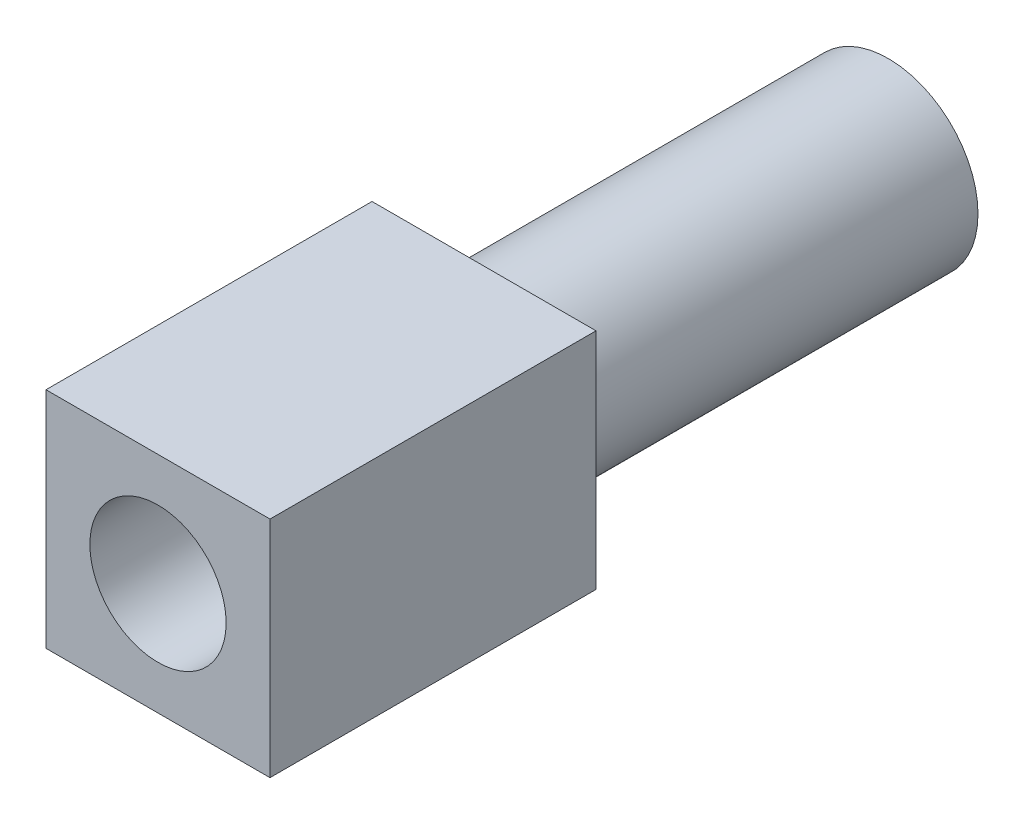
ISO-10303-21;
HEADER;
FILE_DESCRIPTION(('STEP AP214'),'2;1');
FILE_NAME('part.step','',(''),(''),'','','');
FILE_SCHEMA(('AUTOMOTIVE_DESIGN { 1 0 10303 214 1 1 1 1 }'));
ENDSEC;
DATA;
#1=APPLICATION_CONTEXT('core data for automotive mechanical design processes');
#2=APPLICATION_PROTOCOL_DEFINITION('international standard','automotive_design',2000,#1);
#3=PRODUCT_CONTEXT('',#1,'mechanical');
#4=PRODUCT('Part','Part','',(#3));
#5=PRODUCT_RELATED_PRODUCT_CATEGORY('part','',(#4));
#6=PRODUCT_DEFINITION_FORMATION('','',#4);
#7=PRODUCT_DEFINITION_CONTEXT('part definition',#1,'design');
#8=PRODUCT_DEFINITION('design','',#6,#7);
#9=PRODUCT_DEFINITION_SHAPE('','',#8);
#10=(LENGTH_UNIT() NAMED_UNIT(*) SI_UNIT(.MILLI.,.METRE.));
#11=(NAMED_UNIT(*) PLANE_ANGLE_UNIT() SI_UNIT($,.RADIAN.));
#12=(NAMED_UNIT(*) SI_UNIT($,.STERADIAN.) SOLID_ANGLE_UNIT());
#13=UNCERTAINTY_MEASURE_WITH_UNIT(LENGTH_MEASURE(1.E-05),#10,'distance_accuracy_value','');
#14=(GEOMETRIC_REPRESENTATION_CONTEXT(3) GLOBAL_UNCERTAINTY_ASSIGNED_CONTEXT((#13)) GLOBAL_UNIT_ASSIGNED_CONTEXT((#10,
#11,#12)) REPRESENTATION_CONTEXT('',''));
#15=CARTESIAN_POINT('',(0.,0.,0.));
#16=DIRECTION('',(0.,0.,1.));
#17=DIRECTION('',(1.,0.,0.));
#18=AXIS2_PLACEMENT_3D('',#15,#16,#17);
#19=CARTESIAN_POINT('',(0.,0.,0.));
#20=DIRECTION('',(0.,0.,1.));
#21=DIRECTION('',(1.,0.,0.));
#22=AXIS2_PLACEMENT_3D('',#19,#20,#21);
#23=PLANE('',#22);
#24=DIRECTION('',(0.,-1.,0.));
#25=VECTOR('',#24,1.);
#26=CARTESIAN_POINT('',(-37.0560711306256,15.4804,0.));
#27=LINE('',#26,#25);
#28=CARTESIAN_POINT('',(-37.0560711306256,15.4804,0.));
#29=VERTEX_POINT('',#28);
#30=CARTESIAN_POINT('',(-37.0560711306256,1.74039999999999,0.));
#31=VERTEX_POINT('',#30);
#32=EDGE_CURVE('E123',#29,#31,#27,.T.);
#33=ORIENTED_EDGE('',*,*,#32,.F.);
#34=DIRECTION('',(-1.,0.,0.));
#35=VECTOR('',#34,1.);
#36=CARTESIAN_POINT('',(-37.0560711306256,15.4804,0.));
#37=LINE('',#36,#35);
#38=CARTESIAN_POINT('',(-23.3160711306256,15.4804,0.));
#39=VERTEX_POINT('',#38);
#40=EDGE_CURVE('E78',#39,#29,#37,.T.);
#41=ORIENTED_EDGE('',*,*,#40,.F.);
#42=DIRECTION('',(0.,1.,0.));
#43=VECTOR('',#42,1.);
#44=CARTESIAN_POINT('',(-23.3160711306256,15.4804,0.));
#45=LINE('',#44,#43);
#46=CARTESIAN_POINT('',(-23.3160711306256,1.74039999999999,0.));
#47=VERTEX_POINT('',#46);
#48=EDGE_CURVE('E137',#47,#39,#45,.T.);
#49=ORIENTED_EDGE('',*,*,#48,.F.);
#50=DIRECTION('',(1.,0.,0.));
#51=VECTOR('',#50,1.);
#52=CARTESIAN_POINT('',(-37.0560711306256,1.74039999999999,0.));
#53=LINE('',#52,#51);
#54=EDGE_CURVE('E135',#31,#47,#53,.T.);
#55=ORIENTED_EDGE('',*,*,#54,.F.);
#56=EDGE_LOOP('',(#33,#41,#49,#55));
#57=FACE_BOUND('',#56,.T.);
#58=CARTESIAN_POINT('',(-30.1860711306256,8.61039999999999,0.));
#59=DIRECTION('',(0.,0.,1.));
#60=DIRECTION('',(1.,0.,0.));
#61=AXIS2_PLACEMENT_3D('',#58,#59,#60);
#62=CIRCLE('',#61,5.5);
#63=CARTESIAN_POINT('',(-24.6860711306256,8.61039999999999,0.));
#64=VERTEX_POINT('',#63);
#65=EDGE_CURVE('E11',#64,#64,#62,.F.);
#66=ORIENTED_EDGE('',*,*,#65,.F.);
#67=EDGE_LOOP('',(#66));
#68=FACE_BOUND('',#67,.T.);
#69=ADVANCED_FACE('F33',(#57,#68),#23,.F.);
#70=CARTESIAN_POINT('',(-37.0560711306256,15.4804,20.));
#71=DIRECTION('',(1.,0.,0.));
#72=DIRECTION('',(0.,0.,-1.));
#73=AXIS2_PLACEMENT_3D('',#70,#71,#72);
#74=PLANE('',#73);
#75=ORIENTED_EDGE('',*,*,#32,.T.);
#76=DIRECTION('',(0.,0.,-1.));
#77=VECTOR('',#76,1.);
#78=CARTESIAN_POINT('',(-37.0560711306256,1.74039999999999,20.));
#79=LINE('',#78,#77);
#80=CARTESIAN_POINT('',(-37.0560711306256,1.74039999999999,20.));
#81=VERTEX_POINT('',#80);
#82=EDGE_CURVE('E41',#81,#31,#79,.T.);
#83=ORIENTED_EDGE('',*,*,#82,.F.);
#84=DIRECTION('',(0.,-1.,0.));
#85=VECTOR('',#84,1.);
#86=CARTESIAN_POINT('',(-37.0560711306256,15.4804,20.));
#87=LINE('',#86,#85);
#88=CARTESIAN_POINT('',(-37.0560711306256,15.4804,20.));
#89=VERTEX_POINT('',#88);
#90=EDGE_CURVE('E126',#89,#81,#87,.T.);
#91=ORIENTED_EDGE('',*,*,#90,.F.);
#92=DIRECTION('',(0.,0.,-1.));
#93=VECTOR('',#92,1.);
#94=CARTESIAN_POINT('',(-37.0560711306256,15.4804,20.));
#95=LINE('',#94,#93);
#96=EDGE_CURVE('E132',#89,#29,#95,.T.);
#97=ORIENTED_EDGE('',*,*,#96,.T.);
#98=EDGE_LOOP('',(#75,#83,#91,#97));
#99=FACE_BOUND('',#98,.T.);
#100=ADVANCED_FACE('F35',(#99),#74,.F.);
#101=CARTESIAN_POINT('',(-37.0560711306256,1.74039999999999,20.));
#102=DIRECTION('',(0.,1.,0.));
#103=DIRECTION('',(0.,0.,1.));
#104=AXIS2_PLACEMENT_3D('',#101,#102,#103);
#105=PLANE('',#104);
#106=ORIENTED_EDGE('',*,*,#54,.T.);
#107=DIRECTION('',(0.,0.,-1.));
#108=VECTOR('',#107,1.);
#109=CARTESIAN_POINT('',(-23.3160711306256,1.74039999999999,20.));
#110=LINE('',#109,#108);
#111=CARTESIAN_POINT('',(-23.3160711306256,1.74039999999999,20.));
#112=VERTEX_POINT('',#111);
#113=EDGE_CURVE('E143',#112,#47,#110,.T.);
#114=ORIENTED_EDGE('',*,*,#113,.F.);
#115=DIRECTION('',(1.,0.,0.));
#116=VECTOR('',#115,1.);
#117=CARTESIAN_POINT('',(-37.0560711306256,1.74039999999999,20.));
#118=LINE('',#117,#116);
#119=EDGE_CURVE('E86',#81,#112,#118,.T.);
#120=ORIENTED_EDGE('',*,*,#119,.F.);
#121=ORIENTED_EDGE('',*,*,#82,.T.);
#122=EDGE_LOOP('',(#106,#114,#120,#121));
#123=FACE_BOUND('',#122,.T.);
#124=ADVANCED_FACE('F146',(#123),#105,.F.);
#125=CARTESIAN_POINT('',(-23.3160711306256,15.4804,20.));
#126=DIRECTION('',(-1.,0.,0.));
#127=DIRECTION('',(0.,-1.,0.));
#128=AXIS2_PLACEMENT_3D('',#125,#126,#127);
#129=PLANE('',#128);
#130=ORIENTED_EDGE('',*,*,#48,.T.);
#131=DIRECTION('',(0.,0.,-1.));
#132=VECTOR('',#131,1.);
#133=CARTESIAN_POINT('',(-23.3160711306256,15.4804,20.));
#134=LINE('',#133,#132);
#135=CARTESIAN_POINT('',(-23.3160711306256,15.4804,20.));
#136=VERTEX_POINT('',#135);
#137=EDGE_CURVE('E141',#136,#39,#134,.T.);
#138=ORIENTED_EDGE('',*,*,#137,.F.);
#139=DIRECTION('',(0.,1.,0.));
#140=VECTOR('',#139,1.);
#141=CARTESIAN_POINT('',(-23.3160711306256,15.4804,20.));
#142=LINE('',#141,#140);
#143=EDGE_CURVE('E129',#112,#136,#142,.T.);
#144=ORIENTED_EDGE('',*,*,#143,.F.);
#145=ORIENTED_EDGE('',*,*,#113,.T.);
#146=EDGE_LOOP('',(#130,#138,#144,#145));
#147=FACE_BOUND('',#146,.T.);
#148=ADVANCED_FACE('F155',(#147),#129,.F.);
#149=CARTESIAN_POINT('',(-37.0560711306256,15.4804,20.));
#150=DIRECTION('',(0.,-1.,0.));
#151=DIRECTION('',(0.,0.,-1.));
#152=AXIS2_PLACEMENT_3D('',#149,#150,#151);
#153=PLANE('',#152);
#154=ORIENTED_EDGE('',*,*,#40,.T.);
#155=ORIENTED_EDGE('',*,*,#96,.F.);
#156=DIRECTION('',(-1.,0.,0.));
#157=VECTOR('',#156,1.);
#158=CARTESIAN_POINT('',(-37.0560711306256,15.4804,20.));
#159=LINE('',#158,#157);
#160=EDGE_CURVE('E57',#136,#89,#159,.T.);
#161=ORIENTED_EDGE('',*,*,#160,.F.);
#162=ORIENTED_EDGE('',*,*,#137,.T.);
#163=EDGE_LOOP('',(#154,#155,#161,#162));
#164=FACE_BOUND('',#163,.T.);
#165=ADVANCED_FACE('F157',(#164),#153,.F.);
#166=CARTESIAN_POINT('',(0.,0.,20.));
#167=DIRECTION('',(0.,0.,1.));
#168=DIRECTION('',(1.,0.,0.));
#169=AXIS2_PLACEMENT_3D('',#166,#167,#168);
#170=PLANE('',#169);
#171=CARTESIAN_POINT('',(-30.1860711306256,8.61039999999999,20.));
#172=DIRECTION('',(0.,0.,1.));
#173=DIRECTION('',(1.,0.,0.));
#174=AXIS2_PLACEMENT_3D('',#171,#172,#173);
#175=CIRCLE('',#174,4.18);
#176=CARTESIAN_POINT('',(-26.0060711306256,8.61039999999999,20.));
#177=VERTEX_POINT('',#176);
#178=EDGE_CURVE('E118',#177,#177,#175,.T.);
#179=ORIENTED_EDGE('',*,*,#178,.F.);
#180=EDGE_LOOP('',(#179));
#181=FACE_BOUND('',#180,.T.);
#182=ORIENTED_EDGE('',*,*,#90,.T.);
#183=ORIENTED_EDGE('',*,*,#119,.T.);
#184=ORIENTED_EDGE('',*,*,#143,.T.);
#185=ORIENTED_EDGE('',*,*,#160,.T.);
#186=EDGE_LOOP('',(#182,#183,#184,#185));
#187=FACE_BOUND('',#186,.T.);
#188=ADVANCED_FACE('F158',(#181,#187),#170,.T.);
#189=CARTESIAN_POINT('',(-30.1860711306256,8.61039999999999,10.));
#190=DIRECTION('',(0.,0.,1.));
#191=DIRECTION('',(1.,0.,0.));
#192=AXIS2_PLACEMENT_3D('',#189,#190,#191);
#193=CYLINDRICAL_SURFACE('',#192,4.18);
#194=CARTESIAN_POINT('',(-30.1860711306256,8.61039999999999,10.));
#195=DIRECTION('',(0.,0.,1.));
#196=DIRECTION('',(1.,0.,0.));
#197=AXIS2_PLACEMENT_3D('',#194,#195,#196);
#198=CIRCLE('',#197,4.18);
#199=CARTESIAN_POINT('',(-26.0060711306256,8.61039999999999,10.));
#200=VERTEX_POINT('',#199);
#201=EDGE_CURVE('E120',#200,#200,#198,.T.);
#202=ORIENTED_EDGE('',*,*,#201,.F.);
#203=EDGE_LOOP('',(#202));
#204=FACE_BOUND('',#203,.T.);
#205=ORIENTED_EDGE('',*,*,#178,.T.);
#206=EDGE_LOOP('',(#205));
#207=FACE_BOUND('',#206,.T.);
#208=ADVANCED_FACE('F160',(#204,#207),#193,.F.);
#209=CARTESIAN_POINT('',(-30.1860711306256,8.61039999999999,10.));
#210=DIRECTION('',(0.,0.,1.));
#211=DIRECTION('',(1.,0.,0.));
#212=AXIS2_PLACEMENT_3D('',#209,#210,#211);
#213=PLANE('',#212);
#214=ORIENTED_EDGE('',*,*,#201,.T.);
#215=EDGE_LOOP('',(#214));
#216=FACE_BOUND('',#215,.T.);
#217=ADVANCED_FACE('F167',(#216),#213,.T.);
#218=CARTESIAN_POINT('',(-30.1860711306256,8.61039999999999,-24.8));
#219=DIRECTION('',(0.,0.,1.));
#220=DIRECTION('',(1.,0.,0.));
#221=AXIS2_PLACEMENT_3D('',#218,#219,#220);
#222=CYLINDRICAL_SURFACE('',#221,5.5);
#223=CARTESIAN_POINT('',(-30.1860711306256,8.61039999999999,-24.8));
#224=DIRECTION('',(0.,0.,-1.));
#225=DIRECTION('',(-1.,0.,0.));
#226=AXIS2_PLACEMENT_3D('',#223,#224,#225);
#227=CIRCLE('',#226,5.5);
#228=CARTESIAN_POINT('',(-24.6860711306256,8.61039999999999,-24.8));
#229=VERTEX_POINT('',#228);
#230=EDGE_CURVE('E110',#229,#229,#227,.T.);
#231=CARTESIAN_POINT('',(-24.6860711306256,8.61039999999999,-24.8));
#232=CARTESIAN_POINT('',(-24.6860711306256,8.61039999999999,-24.5416666666667));
#233=CARTESIAN_POINT('',(-24.6860711306256,8.61039999999999,-24.2833333333333));
#234=CARTESIAN_POINT('',(-24.6860711306256,8.61039999999999,-23.7666666666667));
#235=CARTESIAN_POINT('',(-24.6860711306256,8.61039999999999,-23.5083333333333));
#236=CARTESIAN_POINT('',(-24.6860711306256,8.61039999999999,-22.9916666666667));
#237=CARTESIAN_POINT('',(-24.6860711306256,8.61039999999999,-22.7333333333333));
#238=CARTESIAN_POINT('',(-24.6860711306256,8.61039999999999,-22.2166666666667));
#239=CARTESIAN_POINT('',(-24.6860711306256,8.61039999999999,-21.9583333333333));
#240=CARTESIAN_POINT('',(-24.6860711306256,8.61039999999999,-21.4416666666667));
#241=CARTESIAN_POINT('',(-24.6860711306256,8.61039999999999,-21.1833333333333));
#242=CARTESIAN_POINT('',(-24.6860711306256,8.61039999999999,-20.6666666666667));
#243=CARTESIAN_POINT('',(-24.6860711306256,8.61039999999999,-20.4083333333333));
#244=CARTESIAN_POINT('',(-24.6860711306256,8.61039999999999,-19.8916666666667));
#245=CARTESIAN_POINT('',(-24.6860711306256,8.61039999999999,-19.6333333333333));
#246=CARTESIAN_POINT('',(-24.6860711306256,8.61039999999999,-19.1166666666667));
#247=CARTESIAN_POINT('',(-24.6860711306256,8.61039999999999,-18.8583333333333));
#248=CARTESIAN_POINT('',(-24.6860711306256,8.61039999999999,-18.3416666666667));
#249=CARTESIAN_POINT('',(-24.6860711306256,8.61039999999999,-18.0833333333333));
#250=CARTESIAN_POINT('',(-24.6860711306256,8.61039999999999,-17.5666666666667));
#251=CARTESIAN_POINT('',(-24.6860711306256,8.61039999999999,-17.3083333333333));
#252=CARTESIAN_POINT('',(-24.6860711306256,8.61039999999999,-16.7916666666667));
#253=CARTESIAN_POINT('',(-24.6860711306256,8.61039999999999,-16.5333333333333));
#254=CARTESIAN_POINT('',(-24.6860711306256,8.61039999999999,-16.0166666666667));
#255=CARTESIAN_POINT('',(-24.6860711306256,8.61039999999999,-15.7583333333333));
#256=CARTESIAN_POINT('',(-24.6860711306256,8.61039999999999,-15.2416666666667));
#257=CARTESIAN_POINT('',(-24.6860711306256,8.61039999999999,-14.9833333333333));
#258=CARTESIAN_POINT('',(-24.6860711306256,8.61039999999999,-14.4666666666667));
#259=CARTESIAN_POINT('',(-24.6860711306256,8.61039999999999,-14.2083333333333));
#260=CARTESIAN_POINT('',(-24.6860711306256,8.61039999999999,-13.6916666666667));
#261=CARTESIAN_POINT('',(-24.6860711306256,8.61039999999999,-13.4333333333333));
#262=CARTESIAN_POINT('',(-24.6860711306256,8.61039999999999,-12.9166666666667));
#263=CARTESIAN_POINT('',(-24.6860711306256,8.61039999999999,-12.6583333333333));
#264=CARTESIAN_POINT('',(-24.6860711306256,8.61039999999999,-12.1416666666667));
#265=CARTESIAN_POINT('',(-24.6860711306256,8.61039999999999,-11.8833333333333));
#266=CARTESIAN_POINT('',(-24.6860711306256,8.61039999999999,-11.3666666666667));
#267=CARTESIAN_POINT('',(-24.6860711306256,8.61039999999999,-11.1083333333333));
#268=CARTESIAN_POINT('',(-24.6860711306256,8.61039999999999,-10.5916666666667));
#269=CARTESIAN_POINT('',(-24.6860711306256,8.61039999999999,-10.3333333333333));
#270=CARTESIAN_POINT('',(-24.6860711306256,8.61039999999999,-9.81666666666666));
#271=CARTESIAN_POINT('',(-24.6860711306256,8.61039999999999,-9.55833333333333));
#272=CARTESIAN_POINT('',(-24.6860711306256,8.61039999999999,-9.04166666666666));
#273=CARTESIAN_POINT('',(-24.6860711306256,8.61039999999999,-8.78333333333333));
#274=CARTESIAN_POINT('',(-24.6860711306256,8.61039999999999,-8.26666666666667));
#275=CARTESIAN_POINT('',(-24.6860711306256,8.61039999999999,-8.00833333333333));
#276=CARTESIAN_POINT('',(-24.6860711306256,8.61039999999999,-7.49166666666667));
#277=CARTESIAN_POINT('',(-24.6860711306256,8.61039999999999,-7.23333333333333));
#278=CARTESIAN_POINT('',(-24.6860711306256,8.61039999999999,-6.71666666666667));
#279=CARTESIAN_POINT('',(-24.6860711306256,8.61039999999999,-6.45833333333333));
#280=CARTESIAN_POINT('',(-24.6860711306256,8.61039999999999,-5.94166666666667));
#281=CARTESIAN_POINT('',(-24.6860711306256,8.61039999999999,-5.68333333333333));
#282=CARTESIAN_POINT('',(-24.6860711306256,8.61039999999999,-5.16666666666667));
#283=CARTESIAN_POINT('',(-24.6860711306256,8.61039999999999,-4.90833333333333));
#284=CARTESIAN_POINT('',(-24.6860711306256,8.61039999999999,-4.39166666666667));
#285=CARTESIAN_POINT('',(-24.6860711306256,8.61039999999999,-4.13333333333333));
#286=CARTESIAN_POINT('',(-24.6860711306256,8.61039999999999,-3.61666666666667));
#287=CARTESIAN_POINT('',(-24.6860711306256,8.61039999999999,-3.35833333333333));
#288=CARTESIAN_POINT('',(-24.6860711306256,8.61039999999999,-2.84166666666667));
#289=CARTESIAN_POINT('',(-24.6860711306256,8.61039999999999,-2.58333333333333));
#290=CARTESIAN_POINT('',(-24.6860711306256,8.61039999999999,-2.06666666666667));
#291=CARTESIAN_POINT('',(-24.6860711306256,8.61039999999999,-1.80833333333333));
#292=CARTESIAN_POINT('',(-24.6860711306256,8.61039999999999,-1.29166666666667));
#293=CARTESIAN_POINT('',(-24.6860711306256,8.61039999999999,-1.03333333333333));
#294=CARTESIAN_POINT('',(-24.6860711306256,8.61039999999999,-0.516666666666668));
#295=CARTESIAN_POINT('',(-24.6860711306256,8.61039999999999,-0.258333333333334));
#296=CARTESIAN_POINT('',(-24.6860711306256,8.61039999999999,0.));
#297=B_SPLINE_CURVE_WITH_KNOTS('',3,(#231,#232,#233,#234,#235,#236,#237,#238,#239,#240,#241,
#242,#243,#244,#245,#246,#247,#248,#249,#250,#251,#252,#253,#254,#255,#256,#257,#258,#259,#260,
#261,#262,#263,#264,#265,#266,#267,#268,#269,#270,#271,#272,#273,#274,#275,#276,#277,#278,#279,
#280,#281,#282,#283,#284,#285,#286,#287,#288,#289,#290,#291,#292,#293,#294,#295,#296),
.UNSPECIFIED.,.F.,.F.,(4,2,2,2,2,2,2,2,2,2,2,2,2,2,2,2,2,2,2,2,2,2,2,2,2,2,2,2,2,2,2,2,4),(0.,
0.775000000000001,1.55,2.325,3.1,3.875,4.65,5.425,6.2,6.975,7.75,8.525,9.3,10.075,10.85,11.625,
12.4,13.175,13.95,14.725,15.5,16.275,17.05,17.825,18.6,19.375,20.15,20.925,21.7,22.475,23.25,
24.025,24.8),.UNSPECIFIED.);
#298=EDGE_CURVE('BSEAM190',#229,#64,#297,.T.);
#299=ORIENTED_EDGE('',*,*,#230,.F.);
#300=ORIENTED_EDGE('',*,*,#65,.T.);
#301=ORIENTED_EDGE('',*,*,#298,.T.);
#302=ORIENTED_EDGE('',*,*,#298,.F.);
#303=EDGE_LOOP('',(#299,#301,#300,#302));
#304=FACE_BOUND('',#303,.T.);
#305=ADVANCED_FACE('F190',(#304),#222,.T.);
#306=CARTESIAN_POINT('',(-30.1860711306256,8.61039999999999,-24.8));
#307=DIRECTION('',(0.,0.,1.));
#308=DIRECTION('',(1.,0.,0.));
#309=AXIS2_PLACEMENT_3D('',#306,#307,#308);
#310=CYLINDRICAL_SURFACE('',#309,2.49);
#311=CARTESIAN_POINT('',(-30.1860711306256,8.61039999999999,0.));
#312=DIRECTION('',(0.,0.,-1.));
#313=DIRECTION('',(-1.,0.,0.));
#314=AXIS2_PLACEMENT_3D('',#311,#312,#313);
#315=CIRCLE('',#314,2.49);
#316=CARTESIAN_POINT('',(-27.6960711306256,8.61039999999999,0.));
#317=VERTEX_POINT('',#316);
#318=CARTESIAN_POINT('',(-29.6257900061276,11.0365461335895,0.));
#319=VERTEX_POINT('',#318);
#320=EDGE_CURVE('E97',#317,#319,#315,.T.);
#321=ORIENTED_EDGE('',*,*,#320,.F.);
#322=DIRECTION('',(0.,0.,-1.));
#323=VECTOR('',#322,1.);
#324=CARTESIAN_POINT('',(-27.6960711306256,8.61039999999999,0.));
#325=LINE('',#324,#323);
#326=CARTESIAN_POINT('',(-27.6960711306256,8.61039999999999,-24.8));
#327=VERTEX_POINT('',#326);
#328=EDGE_CURVE('E94',#317,#327,#325,.T.);
#329=ORIENTED_EDGE('',*,*,#328,.T.);
#330=CARTESIAN_POINT('',(-30.1860711306256,8.61039999999999,-24.8));
#331=DIRECTION('',(0.,0.,-1.));
#332=DIRECTION('',(-1.,0.,0.));
#333=AXIS2_PLACEMENT_3D('',#330,#331,#332);
#334=CIRCLE('',#333,2.49);
#335=CARTESIAN_POINT('',(-29.6257900061276,11.0365461335895,-24.8));
#336=VERTEX_POINT('',#335);
#337=EDGE_CURVE('E48',#327,#336,#334,.T.);
#338=ORIENTED_EDGE('',*,*,#337,.T.);
#339=DIRECTION('',(0.,0.,-1.));
#340=VECTOR('',#339,1.);
#341=CARTESIAN_POINT('',(-29.6257900061276,11.0365461335895,0.));
#342=LINE('',#341,#340);
#343=EDGE_CURVE('E102',#319,#336,#342,.T.);
#344=ORIENTED_EDGE('',*,*,#343,.F.);
#345=EDGE_LOOP('',(#321,#329,#338,#344));
#346=FACE_BOUND('',#345,.T.);
#347=ADVANCED_FACE('F95',(#346),#310,.F.);
#348=CARTESIAN_POINT('',(-12.7692197437434,-10.1564386513182,0.));
#349=DIRECTION('',(-0.78262778502887,-0.622489959839357,0.));
#350=DIRECTION('',(0.622489959839357,-0.78262778502887,0.));
#351=AXIS2_PLACEMENT_3D('',#348,#349,#350);
#352=PLANE('',#351);
#353=DIRECTION('',(-0.622489959839357,0.78262778502887,0.));
#354=VECTOR('',#353,1.);
#355=CARTESIAN_POINT('',(-12.7692197437434,-10.1564386513182,-24.8));
#356=LINE('',#355,#354);
#357=EDGE_CURVE('E109',#327,#336,#356,.T.);
#358=ORIENTED_EDGE('',*,*,#357,.F.);
#359=ORIENTED_EDGE('',*,*,#328,.F.);
#360=DIRECTION('',(-0.622489959839357,0.78262778502887,0.));
#361=VECTOR('',#360,1.);
#362=CARTESIAN_POINT('',(-12.7692197437434,-10.1564386513182,0.));
#363=LINE('',#362,#361);
#364=EDGE_CURVE('E103',#317,#319,#363,.T.);
#365=ORIENTED_EDGE('',*,*,#364,.T.);
#366=ORIENTED_EDGE('',*,*,#343,.T.);
#367=EDGE_LOOP('',(#358,#359,#365,#366));
#368=FACE_BOUND('',#367,.T.);
#369=ADVANCED_FACE('F112',(#368),#352,.T.);
#370=ORIENTED_EDGE('',*,*,#364,.F.);
#371=ORIENTED_EDGE('',*,*,#320,.T.);
#372=EDGE_LOOP('',(#370,#371));
#373=FACE_BOUND('',#372,.T.);
#374=ADVANCED_FACE('F174',(#373),#23,.F.);
#375=CARTESIAN_POINT('',(-30.1860711306256,8.61039999999999,-24.8));
#376=DIRECTION('',(0.,0.,-1.));
#377=DIRECTION('',(-1.,0.,0.));
#378=AXIS2_PLACEMENT_3D('',#375,#376,#377);
#379=PLANE('',#378);
#380=ORIENTED_EDGE('',*,*,#357,.T.);
#381=ORIENTED_EDGE('',*,*,#337,.F.);
#382=EDGE_LOOP('',(#380,#381));
#383=FACE_BOUND('',#382,.T.);
#384=ORIENTED_EDGE('',*,*,#230,.T.);
#385=EDGE_LOOP('',(#384));
#386=FACE_BOUND('',#385,.T.);
#387=ADVANCED_FACE('F107',(#383,#386),#379,.T.);
#388=CLOSED_SHELL('',(#69,#100,#124,#148,#165,#188,#208,#217,#305,#347,#369,#374,#387));
#389=MANIFOLD_SOLID_BREP('B2',#388);
#390=ADVANCED_BREP_SHAPE_REPRESENTATION('',(#18,#389),#14);
#391=SHAPE_DEFINITION_REPRESENTATION(#9,#390);
ENDSEC;
END-ISO-10303-21;
